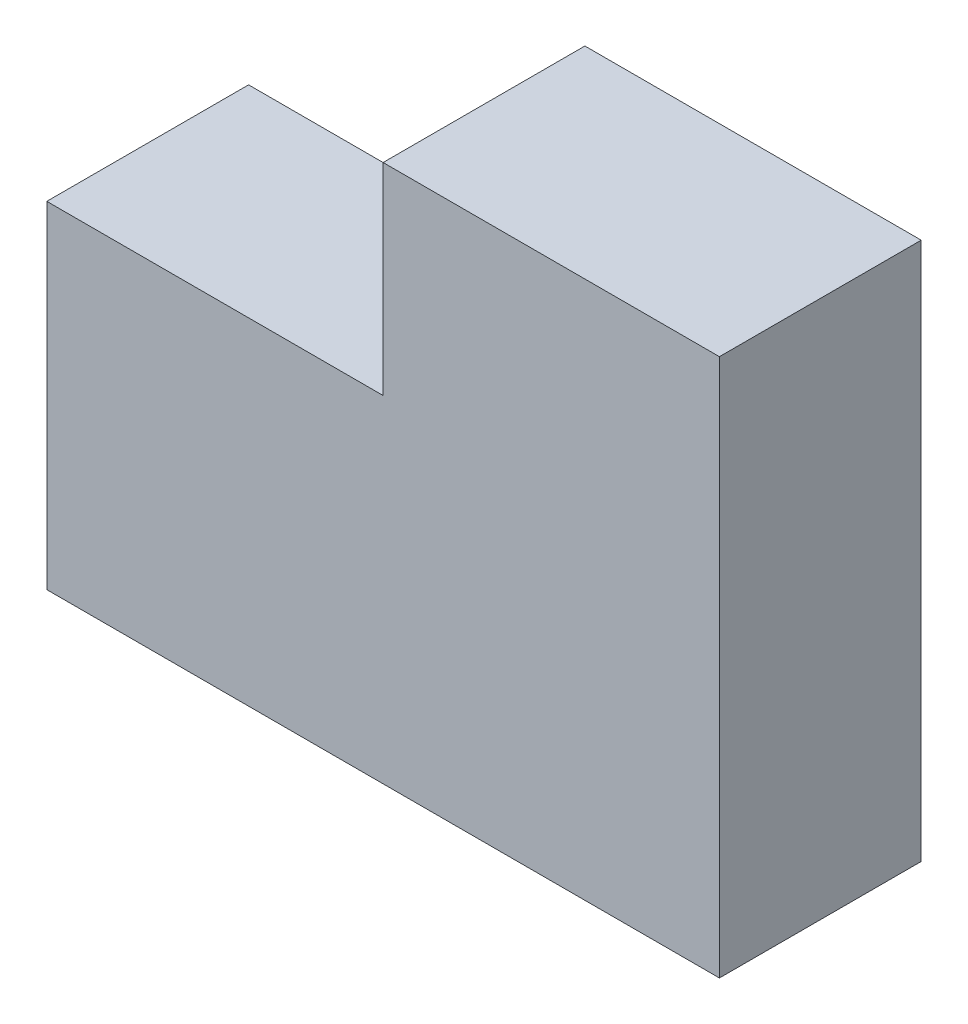
ISO-10303-21;
HEADER;
FILE_DESCRIPTION(('STEP AP214'),'2;1');
FILE_NAME('part.step','',(''),(''),'','','');
FILE_SCHEMA(('AUTOMOTIVE_DESIGN { 1 0 10303 214 1 1 1 1 }'));
ENDSEC;
DATA;
#1=APPLICATION_CONTEXT('core data for automotive mechanical design processes');
#2=APPLICATION_PROTOCOL_DEFINITION('international standard','automotive_design',2000,#1);
#3=PRODUCT_CONTEXT('',#1,'mechanical');
#4=PRODUCT('Part','Part','',(#3));
#5=PRODUCT_RELATED_PRODUCT_CATEGORY('part','',(#4));
#6=PRODUCT_DEFINITION_FORMATION('','',#4);
#7=PRODUCT_DEFINITION_CONTEXT('part definition',#1,'design');
#8=PRODUCT_DEFINITION('design','',#6,#7);
#9=PRODUCT_DEFINITION_SHAPE('','',#8);
#10=(LENGTH_UNIT() NAMED_UNIT(*) SI_UNIT(.MILLI.,.METRE.));
#11=(NAMED_UNIT(*) PLANE_ANGLE_UNIT() SI_UNIT($,.RADIAN.));
#12=(NAMED_UNIT(*) SI_UNIT($,.STERADIAN.) SOLID_ANGLE_UNIT());
#13=UNCERTAINTY_MEASURE_WITH_UNIT(LENGTH_MEASURE(1.E-05),#10,'distance_accuracy_value','');
#14=(GEOMETRIC_REPRESENTATION_CONTEXT(3) GLOBAL_UNCERTAINTY_ASSIGNED_CONTEXT((#13)) GLOBAL_UNIT_ASSIGNED_CONTEXT((#10,
#11,#12)) REPRESENTATION_CONTEXT('',''));
#15=CARTESIAN_POINT('',(0.,0.,0.));
#16=DIRECTION('',(0.,0.,1.));
#17=DIRECTION('',(1.,0.,0.));
#18=AXIS2_PLACEMENT_3D('',#15,#16,#17);
#19=CARTESIAN_POINT('',(0.,5.,3.));
#20=DIRECTION('',(1.,0.,0.));
#21=DIRECTION('',(0.,0.,-1.));
#22=AXIS2_PLACEMENT_3D('',#19,#20,#21);
#23=PLANE('',#22);
#24=DIRECTION('',(0.,-1.,0.));
#25=VECTOR('',#24,1.);
#26=CARTESIAN_POINT('',(0.,5.,0.));
#27=LINE('',#26,#25);
#28=CARTESIAN_POINT('',(0.,5.,0.));
#29=VERTEX_POINT('',#28);
#30=CARTESIAN_POINT('',(0.,0.,0.));
#31=VERTEX_POINT('',#30);
#32=EDGE_CURVE('E120',#29,#31,#27,.T.);
#33=ORIENTED_EDGE('',*,*,#32,.T.);
#34=DIRECTION('',(0.,0.,-1.));
#35=VECTOR('',#34,1.);
#36=CARTESIAN_POINT('',(0.,0.,3.));
#37=LINE('',#36,#35);
#38=CARTESIAN_POINT('',(0.,0.,3.));
#39=VERTEX_POINT('',#38);
#40=EDGE_CURVE('E11',#39,#31,#37,.T.);
#41=ORIENTED_EDGE('',*,*,#40,.F.);
#42=DIRECTION('',(0.,-1.,0.));
#43=VECTOR('',#42,1.);
#44=CARTESIAN_POINT('',(0.,5.,3.));
#45=LINE('',#44,#43);
#46=CARTESIAN_POINT('',(0.,5.,3.));
#47=VERTEX_POINT('',#46);
#48=EDGE_CURVE('E130',#47,#39,#45,.T.);
#49=ORIENTED_EDGE('',*,*,#48,.F.);
#50=DIRECTION('',(0.,0.,-1.));
#51=VECTOR('',#50,1.);
#52=CARTESIAN_POINT('',(0.,5.,3.));
#53=LINE('',#52,#51);
#54=EDGE_CURVE('E116',#47,#29,#53,.T.);
#55=ORIENTED_EDGE('',*,*,#54,.T.);
#56=EDGE_LOOP('',(#33,#41,#49,#55));
#57=FACE_BOUND('',#56,.T.);
#58=ADVANCED_FACE('F36',(#57),#23,.F.);
#59=CARTESIAN_POINT('',(0.,0.,3.));
#60=DIRECTION('',(0.,1.,0.));
#61=DIRECTION('',(0.,0.,1.));
#62=AXIS2_PLACEMENT_3D('',#59,#60,#61);
#63=PLANE('',#62);
#64=DIRECTION('',(1.,0.,0.));
#65=VECTOR('',#64,1.);
#66=CARTESIAN_POINT('',(0.,0.,0.));
#67=LINE('',#66,#65);
#68=CARTESIAN_POINT('',(10.,0.,0.));
#69=VERTEX_POINT('',#68);
#70=EDGE_CURVE('E123',#31,#69,#67,.T.);
#71=ORIENTED_EDGE('',*,*,#70,.T.);
#72=DIRECTION('',(0.,0.,-1.));
#73=VECTOR('',#72,1.);
#74=CARTESIAN_POINT('',(10.,0.,3.));
#75=LINE('',#74,#73);
#76=CARTESIAN_POINT('',(10.,0.,3.));
#77=VERTEX_POINT('',#76);
#78=EDGE_CURVE('E44',#77,#69,#75,.T.);
#79=ORIENTED_EDGE('',*,*,#78,.F.);
#80=DIRECTION('',(1.,0.,0.));
#81=VECTOR('',#80,1.);
#82=CARTESIAN_POINT('',(0.,0.,3.));
#83=LINE('',#82,#81);
#84=EDGE_CURVE('E89',#39,#77,#83,.T.);
#85=ORIENTED_EDGE('',*,*,#84,.F.);
#86=ORIENTED_EDGE('',*,*,#40,.T.);
#87=EDGE_LOOP('',(#71,#79,#85,#86));
#88=FACE_BOUND('',#87,.T.);
#89=ADVANCED_FACE('F154',(#88),#63,.F.);
#90=CARTESIAN_POINT('',(10.,0.,3.));
#91=DIRECTION('',(-1.,0.,0.));
#92=DIRECTION('',(0.,-1.,0.));
#93=AXIS2_PLACEMENT_3D('',#90,#91,#92);
#94=PLANE('',#93);
#95=DIRECTION('',(0.,1.,0.));
#96=VECTOR('',#95,1.);
#97=CARTESIAN_POINT('',(10.,0.,0.));
#98=LINE('',#97,#96);
#99=CARTESIAN_POINT('',(10.,8.,0.));
#100=VERTEX_POINT('',#99);
#101=EDGE_CURVE('E125',#69,#100,#98,.T.);
#102=ORIENTED_EDGE('',*,*,#101,.T.);
#103=DIRECTION('',(0.,0.,-1.));
#104=VECTOR('',#103,1.);
#105=CARTESIAN_POINT('',(10.,8.,3.));
#106=LINE('',#105,#104);
#107=CARTESIAN_POINT('',(10.,8.,3.));
#108=VERTEX_POINT('',#107);
#109=EDGE_CURVE('E111',#108,#100,#106,.T.);
#110=ORIENTED_EDGE('',*,*,#109,.F.);
#111=DIRECTION('',(0.,1.,0.));
#112=VECTOR('',#111,1.);
#113=CARTESIAN_POINT('',(10.,0.,3.));
#114=LINE('',#113,#112);
#115=EDGE_CURVE('E102',#77,#108,#114,.T.);
#116=ORIENTED_EDGE('',*,*,#115,.F.);
#117=ORIENTED_EDGE('',*,*,#78,.T.);
#118=EDGE_LOOP('',(#102,#110,#116,#117));
#119=FACE_BOUND('',#118,.T.);
#120=ADVANCED_FACE('F136',(#119),#94,.F.);
#121=CARTESIAN_POINT('',(10.,8.,3.));
#122=DIRECTION('',(0.,-1.,0.));
#123=DIRECTION('',(0.,0.,-1.));
#124=AXIS2_PLACEMENT_3D('',#121,#122,#123);
#125=PLANE('',#124);
#126=DIRECTION('',(-1.,0.,0.));
#127=VECTOR('',#126,1.);
#128=CARTESIAN_POINT('',(10.,8.,0.));
#129=LINE('',#128,#127);
#130=CARTESIAN_POINT('',(5.,8.,0.));
#131=VERTEX_POINT('',#130);
#132=EDGE_CURVE('E110',#100,#131,#129,.T.);
#133=ORIENTED_EDGE('',*,*,#132,.T.);
#134=DIRECTION('',(0.,0.,-1.));
#135=VECTOR('',#134,1.);
#136=CARTESIAN_POINT('',(5.,8.,3.));
#137=LINE('',#136,#135);
#138=CARTESIAN_POINT('',(5.,8.,3.));
#139=VERTEX_POINT('',#138);
#140=EDGE_CURVE('E107',#139,#131,#137,.T.);
#141=ORIENTED_EDGE('',*,*,#140,.F.);
#142=DIRECTION('',(-1.,0.,0.));
#143=VECTOR('',#142,1.);
#144=CARTESIAN_POINT('',(10.,8.,3.));
#145=LINE('',#144,#143);
#146=EDGE_CURVE('E96',#108,#139,#145,.T.);
#147=ORIENTED_EDGE('',*,*,#146,.F.);
#148=ORIENTED_EDGE('',*,*,#109,.T.);
#149=EDGE_LOOP('',(#133,#141,#147,#148));
#150=FACE_BOUND('',#149,.T.);
#151=ADVANCED_FACE('F108',(#150),#125,.F.);
#152=CARTESIAN_POINT('',(5.,8.,3.));
#153=DIRECTION('',(1.,0.,0.));
#154=DIRECTION('',(0.,1.,0.));
#155=AXIS2_PLACEMENT_3D('',#152,#153,#154);
#156=PLANE('',#155);
#157=DIRECTION('',(0.,-1.,0.));
#158=VECTOR('',#157,1.);
#159=CARTESIAN_POINT('',(5.,8.,0.));
#160=LINE('',#159,#158);
#161=CARTESIAN_POINT('',(5.,5.,0.));
#162=VERTEX_POINT('',#161);
#163=EDGE_CURVE('E75',#131,#162,#160,.T.);
#164=ORIENTED_EDGE('',*,*,#163,.T.);
#165=DIRECTION('',(0.,0.,-1.));
#166=VECTOR('',#165,1.);
#167=CARTESIAN_POINT('',(5.,5.,3.));
#168=LINE('',#167,#166);
#169=CARTESIAN_POINT('',(5.,5.,3.));
#170=VERTEX_POINT('',#169);
#171=EDGE_CURVE('E112',#170,#162,#168,.T.);
#172=ORIENTED_EDGE('',*,*,#171,.F.);
#173=DIRECTION('',(0.,-1.,0.));
#174=VECTOR('',#173,1.);
#175=CARTESIAN_POINT('',(5.,8.,3.));
#176=LINE('',#175,#174);
#177=EDGE_CURVE('E100',#139,#170,#176,.T.);
#178=ORIENTED_EDGE('',*,*,#177,.F.);
#179=ORIENTED_EDGE('',*,*,#140,.T.);
#180=EDGE_LOOP('',(#164,#172,#178,#179));
#181=FACE_BOUND('',#180,.T.);
#182=ADVANCED_FACE('F114',(#181),#156,.F.);
#183=CARTESIAN_POINT('',(5.,5.,3.));
#184=DIRECTION('',(0.,-1.,0.));
#185=DIRECTION('',(0.,0.,-1.));
#186=AXIS2_PLACEMENT_3D('',#183,#184,#185);
#187=PLANE('',#186);
#188=DIRECTION('',(-1.,0.,0.));
#189=VECTOR('',#188,1.);
#190=CARTESIAN_POINT('',(5.,5.,0.));
#191=LINE('',#190,#189);
#192=EDGE_CURVE('E81',#162,#29,#191,.T.);
#193=ORIENTED_EDGE('',*,*,#192,.T.);
#194=ORIENTED_EDGE('',*,*,#54,.F.);
#195=DIRECTION('',(-1.,0.,0.));
#196=VECTOR('',#195,1.);
#197=CARTESIAN_POINT('',(5.,5.,3.));
#198=LINE('',#197,#196);
#199=EDGE_CURVE('E52',#170,#47,#198,.T.);
#200=ORIENTED_EDGE('',*,*,#199,.F.);
#201=ORIENTED_EDGE('',*,*,#171,.T.);
#202=EDGE_LOOP('',(#193,#194,#200,#201));
#203=FACE_BOUND('',#202,.T.);
#204=ADVANCED_FACE('F143',(#203),#187,.F.);
#205=CARTESIAN_POINT('',(0.,0.,3.));
#206=DIRECTION('',(0.,0.,1.));
#207=DIRECTION('',(1.,0.,0.));
#208=AXIS2_PLACEMENT_3D('',#205,#206,#207);
#209=PLANE('',#208);
#210=ORIENTED_EDGE('',*,*,#48,.T.);
#211=ORIENTED_EDGE('',*,*,#84,.T.);
#212=ORIENTED_EDGE('',*,*,#115,.T.);
#213=ORIENTED_EDGE('',*,*,#146,.T.);
#214=ORIENTED_EDGE('',*,*,#177,.T.);
#215=ORIENTED_EDGE('',*,*,#199,.T.);
#216=EDGE_LOOP('',(#210,#211,#212,#213,#214,#215));
#217=FACE_BOUND('',#216,.T.);
#218=ADVANCED_FACE('F98',(#217),#209,.T.);
#219=CARTESIAN_POINT('',(0.,0.,0.));
#220=DIRECTION('',(0.,0.,1.));
#221=DIRECTION('',(1.,0.,0.));
#222=AXIS2_PLACEMENT_3D('',#219,#220,#221);
#223=PLANE('',#222);
#224=ORIENTED_EDGE('',*,*,#32,.F.);
#225=ORIENTED_EDGE('',*,*,#192,.F.);
#226=ORIENTED_EDGE('',*,*,#163,.F.);
#227=ORIENTED_EDGE('',*,*,#132,.F.);
#228=ORIENTED_EDGE('',*,*,#101,.F.);
#229=ORIENTED_EDGE('',*,*,#70,.F.);
#230=EDGE_LOOP('',(#224,#225,#226,#227,#228,#229));
#231=FACE_BOUND('',#230,.T.);
#232=ADVANCED_FACE('F139',(#231),#223,.F.);
#233=CLOSED_SHELL('',(#58,#89,#120,#151,#182,#204,#218,#232));
#234=MANIFOLD_SOLID_BREP('B2',#233);
#235=ADVANCED_BREP_SHAPE_REPRESENTATION('',(#18,#234),#14);
#236=SHAPE_DEFINITION_REPRESENTATION(#9,#235);
ENDSEC;
END-ISO-10303-21;
